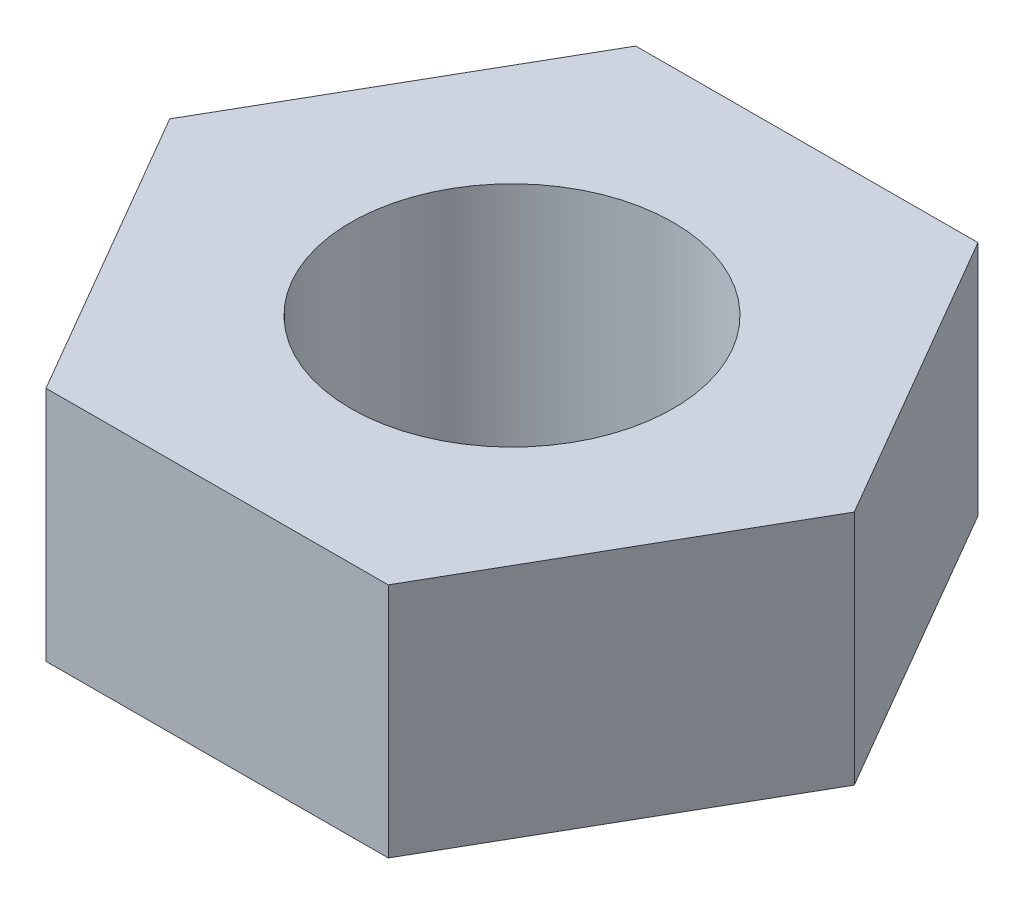
ISO-10303-21;
HEADER;
FILE_DESCRIPTION(('STEP AP214'),'2;1');
FILE_NAME('part.step','',(''),(''),'','','');
FILE_SCHEMA(('AUTOMOTIVE_DESIGN { 1 0 10303 214 1 1 1 1 }'));
ENDSEC;
DATA;
#1=APPLICATION_CONTEXT('core data for automotive mechanical design processes');
#2=APPLICATION_PROTOCOL_DEFINITION('international standard','automotive_design',2000,#1);
#3=PRODUCT_CONTEXT('',#1,'mechanical');
#4=PRODUCT('Part','Part','',(#3));
#5=PRODUCT_RELATED_PRODUCT_CATEGORY('part','',(#4));
#6=PRODUCT_DEFINITION_FORMATION('','',#4);
#7=PRODUCT_DEFINITION_CONTEXT('part definition',#1,'design');
#8=PRODUCT_DEFINITION('design','',#6,#7);
#9=PRODUCT_DEFINITION_SHAPE('','',#8);
#10=(LENGTH_UNIT() NAMED_UNIT(*) SI_UNIT(.MILLI.,.METRE.));
#11=(NAMED_UNIT(*) PLANE_ANGLE_UNIT() SI_UNIT($,.RADIAN.));
#12=(NAMED_UNIT(*) SI_UNIT($,.STERADIAN.) SOLID_ANGLE_UNIT());
#13=UNCERTAINTY_MEASURE_WITH_UNIT(LENGTH_MEASURE(1.E-05),#10,'distance_accuracy_value','');
#14=(GEOMETRIC_REPRESENTATION_CONTEXT(3) GLOBAL_UNCERTAINTY_ASSIGNED_CONTEXT((#13)) GLOBAL_UNIT_ASSIGNED_CONTEXT((#10,
#11,#12)) REPRESENTATION_CONTEXT('',''));
#15=CARTESIAN_POINT('',(0.,0.,0.));
#16=DIRECTION('',(0.,0.,1.));
#17=DIRECTION('',(1.,0.,0.));
#18=AXIS2_PLACEMENT_3D('',#15,#16,#17);
#19=CARTESIAN_POINT('',(0.,2.2,0.));
#20=DIRECTION('',(0.,1.,0.));
#21=DIRECTION('',(0.,0.,1.));
#22=AXIS2_PLACEMENT_3D('',#19,#20,#21);
#23=PLANE('',#22);
#24=DIRECTION('',(-0.502252384917432,0.,-0.864721077483805));
#25=VECTOR('',#24,1.);
#26=CARTESIAN_POINT('',(3.17541572457179,2.2,-0.00826495466008761));
#27=LINE('',#26,#25);
#28=CARTESIAN_POINT('',(3.17541572457179,2.2,-0.00826495466008761));
#29=VERTEX_POINT('',#28);
#30=CARTESIAN_POINT('',(1.58055020158913,2.2,-2.75412316238579));
#31=VERTEX_POINT('',#30);
#32=EDGE_CURVE('E128',#29,#31,#27,.T.);
#33=ORIENTED_EDGE('',*,*,#32,.T.);
#34=DIRECTION('',(-0.999996612747543,0.,0.00260278570791332));
#35=VECTOR('',#34,1.);
#36=CARTESIAN_POINT('',(1.58055020158913,2.2,-2.75412316238579));
#37=LINE('',#36,#35);
#38=CARTESIAN_POINT('',(-1.59486552298266,2.2,-2.7458582077257));
#39=VERTEX_POINT('',#38);
#40=EDGE_CURVE('E86',#31,#39,#37,.T.);
#41=ORIENTED_EDGE('',*,*,#40,.T.);
#42=DIRECTION('',(-0.497744227830111,0.,0.867323863191718));
#43=VECTOR('',#42,1.);
#44=CARTESIAN_POINT('',(-1.59486552298266,2.2,-2.7458582077257));
#45=LINE('',#44,#43);
#46=CARTESIAN_POINT('',(-3.17541572457179,2.2,0.00826495466008773));
#47=VERTEX_POINT('',#46);
#48=EDGE_CURVE('E99',#39,#47,#45,.T.);
#49=ORIENTED_EDGE('',*,*,#48,.T.);
#50=DIRECTION('',(0.502252384917432,0.,0.864721077483805));
#51=VECTOR('',#50,1.);
#52=CARTESIAN_POINT('',(-3.17541572457179,2.2,0.00826495466008773));
#53=LINE('',#52,#51);
#54=CARTESIAN_POINT('',(-1.58055020158913,2.2,2.75412316238579));
#55=VERTEX_POINT('',#54);
#56=EDGE_CURVE('E93',#47,#55,#53,.T.);
#57=ORIENTED_EDGE('',*,*,#56,.T.);
#58=DIRECTION('',(0.999996612747543,0.,-0.00260278570791332));
#59=VECTOR('',#58,1.);
#60=CARTESIAN_POINT('',(-1.58055020158913,2.2,2.75412316238579));
#61=LINE('',#60,#59);
#62=CARTESIAN_POINT('',(1.59486552298266,2.2,2.7458582077257));
#63=VERTEX_POINT('',#62);
#64=EDGE_CURVE('E97',#55,#63,#61,.T.);
#65=ORIENTED_EDGE('',*,*,#64,.T.);
#66=DIRECTION('',(0.497744227830111,0.,-0.867323863191718));
#67=VECTOR('',#66,1.);
#68=CARTESIAN_POINT('',(1.59486552298266,2.2,2.7458582077257));
#69=LINE('',#68,#67);
#70=EDGE_CURVE('E49',#63,#29,#69,.T.);
#71=ORIENTED_EDGE('',*,*,#70,.T.);
#72=EDGE_LOOP('',(#33,#41,#49,#57,#65,#71));
#73=FACE_BOUND('',#72,.T.);
#74=CARTESIAN_POINT('',(0.,2.2,0.));
#75=DIRECTION('',(0.,1.,0.));
#76=DIRECTION('',(0.,0.,1.));
#77=AXIS2_PLACEMENT_3D('',#74,#75,#76);
#78=CIRCLE('',#77,1.5);
#79=CARTESIAN_POINT('',(0.,2.2,1.5));
#80=VERTEX_POINT('',#79);
#81=EDGE_CURVE('E121',#80,#80,#78,.T.);
#82=ORIENTED_EDGE('',*,*,#81,.F.);
#83=EDGE_LOOP('',(#82));
#84=FACE_BOUND('',#83,.T.);
#85=ADVANCED_FACE('F32',(#73,#84),#23,.T.);
#86=CARTESIAN_POINT('',(0.,0.,0.));
#87=DIRECTION('',(0.,1.,0.));
#88=DIRECTION('',(0.,0.,1.));
#89=AXIS2_PLACEMENT_3D('',#86,#87,#88);
#90=PLANE('',#89);
#91=DIRECTION('',(-0.502252384917432,0.,-0.864721077483805));
#92=VECTOR('',#91,1.);
#93=CARTESIAN_POINT('',(3.17541572457179,0.,-0.00826495466008761));
#94=LINE('',#93,#92);
#95=CARTESIAN_POINT('',(3.17541572457179,0.,-0.00826495466008761));
#96=VERTEX_POINT('',#95);
#97=CARTESIAN_POINT('',(1.58055020158913,0.,-2.75412316238579));
#98=VERTEX_POINT('',#97);
#99=EDGE_CURVE('E117',#96,#98,#94,.T.);
#100=ORIENTED_EDGE('',*,*,#99,.F.);
#101=DIRECTION('',(0.497744227830111,0.,-0.867323863191718));
#102=VECTOR('',#101,1.);
#103=CARTESIAN_POINT('',(1.59486552298266,0.,2.7458582077257));
#104=LINE('',#103,#102);
#105=CARTESIAN_POINT('',(1.59486552298266,0.,2.7458582077257));
#106=VERTEX_POINT('',#105);
#107=EDGE_CURVE('E78',#106,#96,#104,.T.);
#108=ORIENTED_EDGE('',*,*,#107,.F.);
#109=DIRECTION('',(0.999996612747543,0.,-0.00260278570791332));
#110=VECTOR('',#109,1.);
#111=CARTESIAN_POINT('',(-1.58055020158913,0.,2.75412316238579));
#112=LINE('',#111,#110);
#113=CARTESIAN_POINT('',(-1.58055020158913,0.,2.75412316238579));
#114=VERTEX_POINT('',#113);
#115=EDGE_CURVE('E72',#114,#106,#112,.T.);
#116=ORIENTED_EDGE('',*,*,#115,.F.);
#117=DIRECTION('',(0.502252384917432,0.,0.864721077483805));
#118=VECTOR('',#117,1.);
#119=CARTESIAN_POINT('',(-3.17541572457179,0.,0.00826495466008773));
#120=LINE('',#119,#118);
#121=CARTESIAN_POINT('',(-3.17541572457179,0.,0.00826495466008773));
#122=VERTEX_POINT('',#121);
#123=EDGE_CURVE('E107',#122,#114,#120,.T.);
#124=ORIENTED_EDGE('',*,*,#123,.F.);
#125=DIRECTION('',(-0.497744227830111,0.,0.867323863191718));
#126=VECTOR('',#125,1.);
#127=CARTESIAN_POINT('',(-1.59486552298266,0.,-2.7458582077257));
#128=LINE('',#127,#126);
#129=CARTESIAN_POINT('',(-1.59486552298266,0.,-2.7458582077257));
#130=VERTEX_POINT('',#129);
#131=EDGE_CURVE('E123',#130,#122,#128,.T.);
#132=ORIENTED_EDGE('',*,*,#131,.F.);
#133=DIRECTION('',(-0.999996612747543,0.,0.00260278570791332));
#134=VECTOR('',#133,1.);
#135=CARTESIAN_POINT('',(1.58055020158913,0.,-2.75412316238579));
#136=LINE('',#135,#134);
#137=EDGE_CURVE('E120',#98,#130,#136,.T.);
#138=ORIENTED_EDGE('',*,*,#137,.F.);
#139=EDGE_LOOP('',(#100,#108,#116,#124,#132,#138));
#140=FACE_BOUND('',#139,.T.);
#141=CARTESIAN_POINT('',(0.,0.,0.));
#142=DIRECTION('',(0.,1.,0.));
#143=DIRECTION('',(0.,0.,1.));
#144=AXIS2_PLACEMENT_3D('',#141,#142,#143);
#145=CIRCLE('',#144,1.5);
#146=CARTESIAN_POINT('',(0.,0.,1.5));
#147=VERTEX_POINT('',#146);
#148=EDGE_CURVE('E221',#147,#147,#145,.T.);
#149=ORIENTED_EDGE('',*,*,#148,.T.);
#150=EDGE_LOOP('',(#149));
#151=FACE_BOUND('',#150,.T.);
#152=ADVANCED_FACE('F137',(#140,#151),#90,.F.);
#153=CARTESIAN_POINT('',(3.17541572457179,2.2,-0.00826495466008761));
#154=DIRECTION('',(-0.864721077483805,0.,0.502252384917431));
#155=DIRECTION('',(0.502252384917432,0.,0.864721077483805));
#156=AXIS2_PLACEMENT_3D('',#153,#154,#155);
#157=PLANE('',#156);
#158=ORIENTED_EDGE('',*,*,#99,.T.);
#159=DIRECTION('',(0.,-1.,0.));
#160=VECTOR('',#159,1.);
#161=CARTESIAN_POINT('',(1.58055020158913,2.2,-2.75412316238579));
#162=LINE('',#161,#160);
#163=EDGE_CURVE('E11',#31,#98,#162,.T.);
#164=ORIENTED_EDGE('',*,*,#163,.F.);
#165=ORIENTED_EDGE('',*,*,#32,.F.);
#166=DIRECTION('',(0.,-1.,0.));
#167=VECTOR('',#166,1.);
#168=CARTESIAN_POINT('',(3.17541572457179,2.2,-0.00826495466008761));
#169=LINE('',#168,#167);
#170=EDGE_CURVE('E113',#29,#96,#169,.T.);
#171=ORIENTED_EDGE('',*,*,#170,.T.);
#172=EDGE_LOOP('',(#158,#164,#165,#171));
#173=FACE_BOUND('',#172,.T.);
#174=ADVANCED_FACE('F34',(#173),#157,.F.);
#175=CARTESIAN_POINT('',(1.58055020158913,2.2,-2.75412316238579));
#176=DIRECTION('',(0.00260278570791332,0.,0.999996612747543));
#177=DIRECTION('',(0.999996612747543,0.,-0.00260278570791332));
#178=AXIS2_PLACEMENT_3D('',#175,#176,#177);
#179=PLANE('',#178);
#180=ORIENTED_EDGE('',*,*,#137,.T.);
#181=DIRECTION('',(0.,-1.,0.));
#182=VECTOR('',#181,1.);
#183=CARTESIAN_POINT('',(-1.59486552298266,2.2,-2.7458582077257));
#184=LINE('',#183,#182);
#185=EDGE_CURVE('E41',#39,#130,#184,.T.);
#186=ORIENTED_EDGE('',*,*,#185,.F.);
#187=ORIENTED_EDGE('',*,*,#40,.F.);
#188=ORIENTED_EDGE('',*,*,#163,.T.);
#189=EDGE_LOOP('',(#180,#186,#187,#188));
#190=FACE_BOUND('',#189,.T.);
#191=ADVANCED_FACE('F162',(#190),#179,.F.);
#192=CARTESIAN_POINT('',(-1.59486552298266,2.2,-2.7458582077257));
#193=DIRECTION('',(0.867323863191718,0.,0.497744227830111));
#194=DIRECTION('',(0.497744227830111,0.,-0.867323863191718));
#195=AXIS2_PLACEMENT_3D('',#192,#193,#194);
#196=PLANE('',#195);
#197=ORIENTED_EDGE('',*,*,#131,.T.);
#198=DIRECTION('',(0.,-1.,0.));
#199=VECTOR('',#198,1.);
#200=CARTESIAN_POINT('',(-3.17541572457179,2.2,0.00826495466008773));
#201=LINE('',#200,#199);
#202=EDGE_CURVE('E108',#47,#122,#201,.T.);
#203=ORIENTED_EDGE('',*,*,#202,.F.);
#204=ORIENTED_EDGE('',*,*,#48,.F.);
#205=ORIENTED_EDGE('',*,*,#185,.T.);
#206=EDGE_LOOP('',(#197,#203,#204,#205));
#207=FACE_BOUND('',#206,.T.);
#208=ADVANCED_FACE('F134',(#207),#196,.F.);
#209=CARTESIAN_POINT('',(-3.17541572457179,2.2,0.00826495466008773));
#210=DIRECTION('',(0.864721077483805,0.,-0.502252384917431));
#211=DIRECTION('',(-0.502252384917432,0.,-0.864721077483805));
#212=AXIS2_PLACEMENT_3D('',#209,#210,#211);
#213=PLANE('',#212);
#214=ORIENTED_EDGE('',*,*,#123,.T.);
#215=DIRECTION('',(0.,-1.,0.));
#216=VECTOR('',#215,1.);
#217=CARTESIAN_POINT('',(-1.58055020158913,2.2,2.75412316238579));
#218=LINE('',#217,#216);
#219=EDGE_CURVE('E104',#55,#114,#218,.T.);
#220=ORIENTED_EDGE('',*,*,#219,.F.);
#221=ORIENTED_EDGE('',*,*,#56,.F.);
#222=ORIENTED_EDGE('',*,*,#202,.T.);
#223=EDGE_LOOP('',(#214,#220,#221,#222));
#224=FACE_BOUND('',#223,.T.);
#225=ADVANCED_FACE('F105',(#224),#213,.F.);
#226=CARTESIAN_POINT('',(-1.58055020158913,2.2,2.75412316238579));
#227=DIRECTION('',(-0.00260278570791332,0.,-0.999996612747543));
#228=DIRECTION('',(-0.999996612747543,0.,0.00260278570791332));
#229=AXIS2_PLACEMENT_3D('',#226,#227,#228);
#230=PLANE('',#229);
#231=ORIENTED_EDGE('',*,*,#115,.T.);
#232=DIRECTION('',(0.,-1.,0.));
#233=VECTOR('',#232,1.);
#234=CARTESIAN_POINT('',(1.59486552298266,2.2,2.7458582077257));
#235=LINE('',#234,#233);
#236=EDGE_CURVE('E109',#63,#106,#235,.T.);
#237=ORIENTED_EDGE('',*,*,#236,.F.);
#238=ORIENTED_EDGE('',*,*,#64,.F.);
#239=ORIENTED_EDGE('',*,*,#219,.T.);
#240=EDGE_LOOP('',(#231,#237,#238,#239));
#241=FACE_BOUND('',#240,.T.);
#242=ADVANCED_FACE('F111',(#241),#230,.F.);
#243=CARTESIAN_POINT('',(1.59486552298266,2.2,2.7458582077257));
#244=DIRECTION('',(-0.867323863191718,0.,-0.497744227830111));
#245=DIRECTION('',(-0.497744227830111,0.,0.867323863191718));
#246=AXIS2_PLACEMENT_3D('',#243,#244,#245);
#247=PLANE('',#246);
#248=ORIENTED_EDGE('',*,*,#107,.T.);
#249=ORIENTED_EDGE('',*,*,#170,.F.);
#250=ORIENTED_EDGE('',*,*,#70,.F.);
#251=ORIENTED_EDGE('',*,*,#236,.T.);
#252=EDGE_LOOP('',(#248,#249,#250,#251));
#253=FACE_BOUND('',#252,.T.);
#254=ADVANCED_FACE('F142',(#253),#247,.F.);
#255=CARTESIAN_POINT('',(0.,2.2,0.));
#256=DIRECTION('',(0.,-1.,0.));
#257=DIRECTION('',(0.,0.,-1.));
#258=AXIS2_PLACEMENT_3D('',#255,#256,#257);
#259=CYLINDRICAL_SURFACE('',#258,1.5);
#260=ORIENTED_EDGE('',*,*,#81,.T.);
#261=EDGE_LOOP('',(#260));
#262=FACE_BOUND('',#261,.T.);
#263=ORIENTED_EDGE('',*,*,#148,.F.);
#264=EDGE_LOOP('',(#263));
#265=FACE_BOUND('',#264,.T.);
#266=ADVANCED_FACE('F144',(#262,#265),#259,.F.);
#267=CLOSED_SHELL('',(#85,#152,#174,#191,#208,#225,#242,#254,#266));
#268=MANIFOLD_SOLID_BREP('B2',#267);
#269=ADVANCED_BREP_SHAPE_REPRESENTATION('',(#18,#268),#14);
#270=SHAPE_DEFINITION_REPRESENTATION(#9,#269);
ENDSEC;
END-ISO-10303-21;
